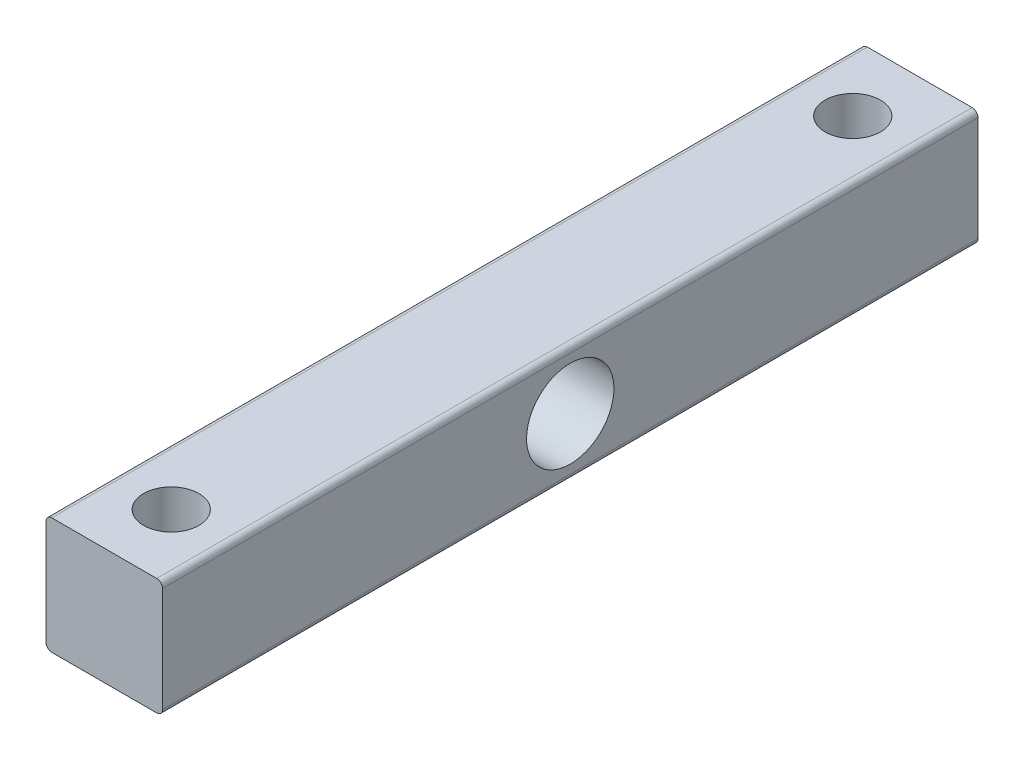
ISO-10303-21;
HEADER;
FILE_DESCRIPTION(('STEP AP214'),'2;1');
FILE_NAME('part.step','',(''),(''),'','','');
FILE_SCHEMA(('AUTOMOTIVE_DESIGN { 1 0 10303 214 1 1 1 1 }'));
ENDSEC;
DATA;
#1=APPLICATION_CONTEXT('core data for automotive mechanical design processes');
#2=APPLICATION_PROTOCOL_DEFINITION('international standard','automotive_design',2000,#1);
#3=PRODUCT_CONTEXT('',#1,'mechanical');
#4=PRODUCT('Part','Part','',(#3));
#5=PRODUCT_RELATED_PRODUCT_CATEGORY('part','',(#4));
#6=PRODUCT_DEFINITION_FORMATION('','',#4);
#7=PRODUCT_DEFINITION_CONTEXT('part definition',#1,'design');
#8=PRODUCT_DEFINITION('design','',#6,#7);
#9=PRODUCT_DEFINITION_SHAPE('','',#8);
#10=(LENGTH_UNIT() NAMED_UNIT(*) SI_UNIT(.MILLI.,.METRE.));
#11=(NAMED_UNIT(*) PLANE_ANGLE_UNIT() SI_UNIT($,.RADIAN.));
#12=(NAMED_UNIT(*) SI_UNIT($,.STERADIAN.) SOLID_ANGLE_UNIT());
#13=UNCERTAINTY_MEASURE_WITH_UNIT(LENGTH_MEASURE(1.E-05),#10,'distance_accuracy_value','');
#14=(GEOMETRIC_REPRESENTATION_CONTEXT(3) GLOBAL_UNCERTAINTY_ASSIGNED_CONTEXT((#13)) GLOBAL_UNIT_ASSIGNED_CONTEXT((#10,
#11,#12)) REPRESENTATION_CONTEXT('',''));
#15=CARTESIAN_POINT('',(0.,0.,0.));
#16=DIRECTION('',(0.,0.,1.));
#17=DIRECTION('',(1.,0.,0.));
#18=AXIS2_PLACEMENT_3D('',#15,#16,#17);
#19=CARTESIAN_POINT('',(-0.0910338190855077,2.68374505848245,17.78));
#20=DIRECTION('',(1.,0.,0.));
#21=DIRECTION('',(0.,1.,0.));
#22=AXIS2_PLACEMENT_3D('',#19,#20,#21);
#23=PLANE('',#22);
#24=CARTESIAN_POINT('',(-0.0910338190855074,0.143745058482447,0.));
#25=DIRECTION('',(-1.,0.,0.));
#26=DIRECTION('',(0.,-1.,0.));
#27=AXIS2_PLACEMENT_3D('',#24,#25,#26);
#28=CIRCLE('',#27,1.905);
#29=CARTESIAN_POINT('',(-0.0910338190855071,-1.76125494151755,0.));
#30=VERTEX_POINT('',#29);
#31=EDGE_CURVE('E204',#30,#30,#28,.T.);
#32=ORIENTED_EDGE('',*,*,#31,.F.);
#33=EDGE_LOOP('',(#32));
#34=FACE_BOUND('',#33,.T.);
#35=DIRECTION('',(0.,-1.,0.));
#36=VECTOR('',#35,1.);
#37=CARTESIAN_POINT('',(-0.0910338190855077,2.68374505848245,-17.78));
#38=LINE('',#37,#36);
#39=CARTESIAN_POINT('',(-0.0910338190855076,2.42974505848245,-17.78));
#40=VERTEX_POINT('',#39);
#41=CARTESIAN_POINT('',(-0.0910338190855071,-2.14225494151755,-17.78));
#42=VERTEX_POINT('',#41);
#43=EDGE_CURVE('E192',#40,#42,#38,.T.);
#44=ORIENTED_EDGE('',*,*,#43,.T.);
#45=DIRECTION('',(0.,0.,-1.));
#46=VECTOR('',#45,1.);
#47=CARTESIAN_POINT('',(-0.0910338190855071,-2.14225494151755,17.78));
#48=LINE('',#47,#46);
#49=CARTESIAN_POINT('',(-0.0910338190855071,-2.14225494151755,17.78));
#50=VERTEX_POINT('',#49);
#51=EDGE_CURVE('E113',#42,#50,#48,.F.);
#52=ORIENTED_EDGE('',*,*,#51,.T.);
#53=DIRECTION('',(0.,-1.,0.));
#54=VECTOR('',#53,1.);
#55=CARTESIAN_POINT('',(-0.0910338190855077,2.68374505848245,17.78));
#56=LINE('',#55,#54);
#57=CARTESIAN_POINT('',(-0.0910338190855076,2.42974505848245,17.78));
#58=VERTEX_POINT('',#57);
#59=EDGE_CURVE('E147',#58,#50,#56,.T.);
#60=ORIENTED_EDGE('',*,*,#59,.F.);
#61=DIRECTION('',(0.,0.,-1.));
#62=VECTOR('',#61,1.);
#63=CARTESIAN_POINT('',(-0.0910338190855076,2.42974505848245,17.78));
#64=LINE('',#63,#62);
#65=EDGE_CURVE('E118',#58,#40,#64,.T.);
#66=ORIENTED_EDGE('',*,*,#65,.T.);
#67=EDGE_LOOP('',(#44,#52,#60,#66));
#68=FACE_BOUND('',#67,.T.);
#69=ADVANCED_FACE('F42',(#34,#68),#23,.F.);
#70=CARTESIAN_POINT('',(-0.091033819085507,-2.39625494151755,17.78));
#71=DIRECTION('',(0.,1.,0.));
#72=DIRECTION('',(0.,0.,1.));
#73=AXIS2_PLACEMENT_3D('',#70,#71,#72);
#74=PLANE('',#73);
#75=CARTESIAN_POINT('',(2.44896618091449,-2.39625494151755,-14.859));
#76=DIRECTION('',(0.,1.,0.));
#77=DIRECTION('',(0.,0.,1.));
#78=AXIS2_PLACEMENT_3D('',#75,#76,#77);
#79=CIRCLE('',#78,1.2065);
#80=CARTESIAN_POINT('',(2.44896618091449,-2.39625494151755,-13.6525));
#81=VERTEX_POINT('',#80);
#82=EDGE_CURVE('E193',#81,#81,#79,.T.);
#83=ORIENTED_EDGE('',*,*,#82,.T.);
#84=EDGE_LOOP('',(#83));
#85=FACE_BOUND('',#84,.T.);
#86=CARTESIAN_POINT('',(2.44896618091449,-2.39625494151755,14.859));
#87=DIRECTION('',(0.,1.,0.));
#88=DIRECTION('',(0.,0.,1.));
#89=AXIS2_PLACEMENT_3D('',#86,#87,#88);
#90=CIRCLE('',#89,1.2065);
#91=CARTESIAN_POINT('',(2.44896618091449,-2.39625494151755,16.0655));
#92=VERTEX_POINT('',#91);
#93=EDGE_CURVE('E138',#92,#92,#90,.F.);
#94=ORIENTED_EDGE('',*,*,#93,.F.);
#95=EDGE_LOOP('',(#94));
#96=FACE_BOUND('',#95,.T.);
#97=DIRECTION('',(1.,0.,0.));
#98=VECTOR('',#97,1.);
#99=CARTESIAN_POINT('',(-0.091033819085507,-2.39625494151755,17.78));
#100=LINE('',#99,#98);
#101=CARTESIAN_POINT('',(0.162966180914493,-2.39625494151755,17.78));
#102=VERTEX_POINT('',#101);
#103=CARTESIAN_POINT('',(4.73496618091449,-2.39625494151755,17.78));
#104=VERTEX_POINT('',#103);
#105=EDGE_CURVE('E128',#102,#104,#100,.T.);
#106=ORIENTED_EDGE('',*,*,#105,.F.);
#107=DIRECTION('',(0.,0.,-1.));
#108=VECTOR('',#107,1.);
#109=CARTESIAN_POINT('',(0.162966180914493,-2.39625494151755,17.78));
#110=LINE('',#109,#108);
#111=CARTESIAN_POINT('',(0.162966180914493,-2.39625494151755,-17.78));
#112=VERTEX_POINT('',#111);
#113=EDGE_CURVE('E112',#102,#112,#110,.T.);
#114=ORIENTED_EDGE('',*,*,#113,.T.);
#115=DIRECTION('',(1.,0.,0.));
#116=VECTOR('',#115,1.);
#117=CARTESIAN_POINT('',(-0.091033819085507,-2.39625494151755,-17.78));
#118=LINE('',#117,#116);
#119=CARTESIAN_POINT('',(4.73496618091449,-2.39625494151755,-17.78));
#120=VERTEX_POINT('',#119);
#121=EDGE_CURVE('E125',#112,#120,#118,.T.);
#122=ORIENTED_EDGE('',*,*,#121,.T.);
#123=DIRECTION('',(0.,0.,-1.));
#124=VECTOR('',#123,1.);
#125=CARTESIAN_POINT('',(4.73496618091449,-2.39625494151755,17.78));
#126=LINE('',#125,#124);
#127=EDGE_CURVE('E130',#120,#104,#126,.F.);
#128=ORIENTED_EDGE('',*,*,#127,.T.);
#129=EDGE_LOOP('',(#106,#114,#122,#128));
#130=FACE_BOUND('',#129,.T.);
#131=ADVANCED_FACE('F124',(#85,#96,#130),#74,.F.);
#132=CARTESIAN_POINT('',(4.98896618091449,2.68374505848245,17.78));
#133=DIRECTION('',(-1.,0.,0.));
#134=DIRECTION('',(0.,-1.,0.));
#135=AXIS2_PLACEMENT_3D('',#132,#133,#134);
#136=PLANE('',#135);
#137=CARTESIAN_POINT('',(4.98896618091449,0.143745058482448,0.));
#138=DIRECTION('',(-1.,0.,0.));
#139=DIRECTION('',(0.,-1.,0.));
#140=AXIS2_PLACEMENT_3D('',#137,#138,#139);
#141=CIRCLE('',#140,1.905);
#142=CARTESIAN_POINT('',(4.98896618091449,-1.76125494151755,0.));
#143=VERTEX_POINT('',#142);
#144=EDGE_CURVE('E201',#143,#143,#141,.F.);
#145=ORIENTED_EDGE('',*,*,#144,.F.);
#146=EDGE_LOOP('',(#145));
#147=FACE_BOUND('',#146,.T.);
#148=DIRECTION('',(0.,1.,0.));
#149=VECTOR('',#148,1.);
#150=CARTESIAN_POINT('',(4.98896618091449,2.68374505848245,17.78));
#151=LINE('',#150,#149);
#152=CARTESIAN_POINT('',(4.98896618091449,-2.14225494151755,17.78));
#153=VERTEX_POINT('',#152);
#154=CARTESIAN_POINT('',(4.98896618091449,2.42974505848245,17.78));
#155=VERTEX_POINT('',#154);
#156=EDGE_CURVE('E151',#153,#155,#151,.T.);
#157=ORIENTED_EDGE('',*,*,#156,.F.);
#158=DIRECTION('',(0.,0.,-1.));
#159=VECTOR('',#158,1.);
#160=CARTESIAN_POINT('',(4.98896618091449,-2.14225494151755,17.78));
#161=LINE('',#160,#159);
#162=CARTESIAN_POINT('',(4.98896618091449,-2.14225494151755,-17.78));
#163=VERTEX_POINT('',#162);
#164=EDGE_CURVE('E172',#153,#163,#161,.T.);
#165=ORIENTED_EDGE('',*,*,#164,.T.);
#166=DIRECTION('',(0.,1.,0.));
#167=VECTOR('',#166,1.);
#168=CARTESIAN_POINT('',(4.98896618091449,2.68374505848245,-17.78));
#169=LINE('',#168,#167);
#170=CARTESIAN_POINT('',(4.98896618091449,2.42974505848245,-17.78));
#171=VERTEX_POINT('',#170);
#172=EDGE_CURVE('E135',#163,#171,#169,.T.);
#173=ORIENTED_EDGE('',*,*,#172,.T.);
#174=DIRECTION('',(0.,0.,-1.));
#175=VECTOR('',#174,1.);
#176=CARTESIAN_POINT('',(4.98896618091449,2.42974505848245,17.78));
#177=LINE('',#176,#175);
#178=EDGE_CURVE('E170',#171,#155,#177,.F.);
#179=ORIENTED_EDGE('',*,*,#178,.T.);
#180=EDGE_LOOP('',(#157,#165,#173,#179));
#181=FACE_BOUND('',#180,.T.);
#182=ADVANCED_FACE('F177',(#147,#181),#136,.F.);
#183=CARTESIAN_POINT('',(-0.0910338190855077,2.68374505848245,17.78));
#184=DIRECTION('',(0.,-1.,0.));
#185=DIRECTION('',(0.,0.,-1.));
#186=AXIS2_PLACEMENT_3D('',#183,#184,#185);
#187=PLANE('',#186);
#188=CARTESIAN_POINT('',(2.44896618091449,2.68374505848245,-14.859));
#189=DIRECTION('',(0.,-1.,0.));
#190=DIRECTION('',(0.,0.,-1.));
#191=AXIS2_PLACEMENT_3D('',#188,#189,#190);
#192=CIRCLE('',#191,1.2065);
#193=CARTESIAN_POINT('',(2.44896618091449,2.68374505848245,-13.6525));
#194=VERTEX_POINT('',#193);
#195=EDGE_CURVE('E196',#194,#194,#192,.T.);
#196=ORIENTED_EDGE('',*,*,#195,.T.);
#197=EDGE_LOOP('',(#196));
#198=FACE_BOUND('',#197,.T.);
#199=CARTESIAN_POINT('',(2.44896618091449,2.68374505848245,14.859));
#200=DIRECTION('',(0.,1.,0.));
#201=DIRECTION('',(0.,0.,1.));
#202=AXIS2_PLACEMENT_3D('',#199,#200,#201);
#203=CIRCLE('',#202,1.2065);
#204=CARTESIAN_POINT('',(2.44896618091449,2.68374505848245,16.0655));
#205=VERTEX_POINT('',#204);
#206=EDGE_CURVE('E134',#205,#205,#203,.T.);
#207=ORIENTED_EDGE('',*,*,#206,.F.);
#208=EDGE_LOOP('',(#207));
#209=FACE_BOUND('',#208,.T.);
#210=DIRECTION('',(-1.,0.,0.));
#211=VECTOR('',#210,1.);
#212=CARTESIAN_POINT('',(-0.0910338190855077,2.68374505848245,17.78));
#213=LINE('',#212,#211);
#214=CARTESIAN_POINT('',(4.73496618091449,2.68374505848245,17.78));
#215=VERTEX_POINT('',#214);
#216=CARTESIAN_POINT('',(0.162966180914492,2.68374505848245,17.78));
#217=VERTEX_POINT('',#216);
#218=EDGE_CURVE('E153',#215,#217,#213,.T.);
#219=ORIENTED_EDGE('',*,*,#218,.F.);
#220=DIRECTION('',(0.,0.,-1.));
#221=VECTOR('',#220,1.);
#222=CARTESIAN_POINT('',(4.73496618091449,2.68374505848245,17.78));
#223=LINE('',#222,#221);
#224=CARTESIAN_POINT('',(4.73496618091449,2.68374505848245,-17.78));
#225=VERTEX_POINT('',#224);
#226=EDGE_CURVE('E12',#215,#225,#223,.T.);
#227=ORIENTED_EDGE('',*,*,#226,.T.);
#228=DIRECTION('',(-1.,0.,0.));
#229=VECTOR('',#228,1.);
#230=CARTESIAN_POINT('',(-0.0910338190855077,2.68374505848245,-17.78));
#231=LINE('',#230,#229);
#232=CARTESIAN_POINT('',(0.162966180914492,2.68374505848245,-17.78));
#233=VERTEX_POINT('',#232);
#234=EDGE_CURVE('E141',#225,#233,#231,.T.);
#235=ORIENTED_EDGE('',*,*,#234,.T.);
#236=DIRECTION('',(0.,0.,-1.));
#237=VECTOR('',#236,1.);
#238=CARTESIAN_POINT('',(0.162966180914492,2.68374505848245,17.78));
#239=LINE('',#238,#237);
#240=EDGE_CURVE('E50',#233,#217,#239,.F.);
#241=ORIENTED_EDGE('',*,*,#240,.T.);
#242=EDGE_LOOP('',(#219,#227,#235,#241));
#243=FACE_BOUND('',#242,.T.);
#244=ADVANCED_FACE('F185',(#198,#209,#243),#187,.F.);
#245=CARTESIAN_POINT('',(0.,0.,17.78));
#246=DIRECTION('',(0.,0.,1.));
#247=DIRECTION('',(1.,0.,0.));
#248=AXIS2_PLACEMENT_3D('',#245,#246,#247);
#249=PLANE('',#248);
#250=ORIENTED_EDGE('',*,*,#59,.T.);
#251=CARTESIAN_POINT('',(0.162966180914493,-2.14225494151755,17.78));
#252=DIRECTION('',(0.,0.,1.));
#253=DIRECTION('',(1.,0.,0.));
#254=AXIS2_PLACEMENT_3D('',#251,#252,#253);
#255=CIRCLE('',#254,0.254);
#256=EDGE_CURVE('E168',#50,#102,#255,.T.);
#257=ORIENTED_EDGE('',*,*,#256,.T.);
#258=ORIENTED_EDGE('',*,*,#105,.T.);
#259=CARTESIAN_POINT('',(4.73496618091449,-2.14225494151755,17.78));
#260=DIRECTION('',(0.,0.,1.));
#261=DIRECTION('',(1.,0.,0.));
#262=AXIS2_PLACEMENT_3D('',#259,#260,#261);
#263=CIRCLE('',#262,0.254);
#264=EDGE_CURVE('E166',#104,#153,#263,.T.);
#265=ORIENTED_EDGE('',*,*,#264,.T.);
#266=ORIENTED_EDGE('',*,*,#156,.T.);
#267=CARTESIAN_POINT('',(4.73496618091449,2.42974505848245,17.78));
#268=DIRECTION('',(0.,0.,1.));
#269=DIRECTION('',(1.,0.,0.));
#270=AXIS2_PLACEMENT_3D('',#267,#268,#269);
#271=CIRCLE('',#270,0.254);
#272=EDGE_CURVE('E63',#155,#215,#271,.T.);
#273=ORIENTED_EDGE('',*,*,#272,.T.);
#274=ORIENTED_EDGE('',*,*,#218,.T.);
#275=CARTESIAN_POINT('',(0.162966180914492,2.42974505848245,17.78));
#276=DIRECTION('',(0.,0.,1.));
#277=DIRECTION('',(1.,0.,0.));
#278=AXIS2_PLACEMENT_3D('',#275,#276,#277);
#279=CIRCLE('',#278,0.254);
#280=EDGE_CURVE('E163',#217,#58,#279,.T.);
#281=ORIENTED_EDGE('',*,*,#280,.T.);
#282=EDGE_LOOP('',(#250,#257,#258,#265,#266,#273,#274,#281));
#283=FACE_BOUND('',#282,.T.);
#284=ADVANCED_FACE('F187',(#283),#249,.T.);
#285=CARTESIAN_POINT('',(2.44896618091449,-5.80875226752383,14.859));
#286=DIRECTION('',(0.,1.,0.));
#287=DIRECTION('',(0.,0.,1.));
#288=AXIS2_PLACEMENT_3D('',#285,#286,#287);
#289=CYLINDRICAL_SURFACE('',#288,1.2065);
#290=CARTESIAN_POINT('',(2.44896618091449,-2.39625494151755,16.0655));
#291=CARTESIAN_POINT('',(2.44896618091449,-2.34333827485088,16.0655));
#292=CARTESIAN_POINT('',(2.44896618091449,-2.29042160818422,16.0655));
#293=CARTESIAN_POINT('',(2.44896618091449,-2.18458827485088,16.0655));
#294=CARTESIAN_POINT('',(2.44896618091449,-2.13167160818422,16.0655));
#295=CARTESIAN_POINT('',(2.44896618091449,-2.02583827485088,16.0655));
#296=CARTESIAN_POINT('',(2.44896618091449,-1.97292160818422,16.0655));
#297=CARTESIAN_POINT('',(2.44896618091449,-1.86708827485088,16.0655));
#298=CARTESIAN_POINT('',(2.44896618091449,-1.81417160818422,16.0655));
#299=CARTESIAN_POINT('',(2.44896618091449,-1.70833827485089,16.0655));
#300=CARTESIAN_POINT('',(2.44896618091449,-1.65542160818422,16.0655));
#301=CARTESIAN_POINT('',(2.44896618091449,-1.54958827485089,16.0655));
#302=CARTESIAN_POINT('',(2.44896618091449,-1.49667160818422,16.0655));
#303=CARTESIAN_POINT('',(2.44896618091449,-1.39083827485088,16.0655));
#304=CARTESIAN_POINT('',(2.44896618091449,-1.33792160818422,16.0655));
#305=CARTESIAN_POINT('',(2.44896618091449,-1.23208827485089,16.0655));
#306=CARTESIAN_POINT('',(2.44896618091449,-1.17917160818422,16.0655));
#307=CARTESIAN_POINT('',(2.44896618091449,-1.07333827485089,16.0655));
#308=CARTESIAN_POINT('',(2.44896618091449,-1.02042160818422,16.0655));
#309=CARTESIAN_POINT('',(2.44896618091449,-0.914588274850885,16.0655));
#310=CARTESIAN_POINT('',(2.44896618091449,-0.861671608184218,16.0655));
#311=CARTESIAN_POINT('',(2.44896618091449,-0.755838274850885,16.0655));
#312=CARTESIAN_POINT('',(2.44896618091449,-0.702921608184218,16.0655));
#313=CARTESIAN_POINT('',(2.44896618091449,-0.597088274850885,16.0655));
#314=CARTESIAN_POINT('',(2.44896618091449,-0.544171608184219,16.0655));
#315=CARTESIAN_POINT('',(2.44896618091449,-0.438338274850885,16.0655));
#316=CARTESIAN_POINT('',(2.44896618091449,-0.385421608184218,16.0655));
#317=CARTESIAN_POINT('',(2.44896618091449,-0.279588274850885,16.0655));
#318=CARTESIAN_POINT('',(2.44896618091449,-0.226671608184219,16.0655));
#319=CARTESIAN_POINT('',(2.44896618091449,-0.120838274850885,16.0655));
#320=CARTESIAN_POINT('',(2.44896618091449,-0.0679216081842183,16.0655));
#321=CARTESIAN_POINT('',(2.44896618091449,0.0379117251491151,16.0655));
#322=CARTESIAN_POINT('',(2.44896618091449,0.0908283918157815,16.0655));
#323=CARTESIAN_POINT('',(2.44896618091449,0.196661725149115,16.0655));
#324=CARTESIAN_POINT('',(2.44896618091449,0.249578391815782,16.0655));
#325=CARTESIAN_POINT('',(2.44896618091449,0.355411725149115,16.0655));
#326=CARTESIAN_POINT('',(2.44896618091449,0.408328391815782,16.0655));
#327=CARTESIAN_POINT('',(2.44896618091449,0.514161725149115,16.0655));
#328=CARTESIAN_POINT('',(2.44896618091449,0.567078391815782,16.0655));
#329=CARTESIAN_POINT('',(2.44896618091449,0.672911725149115,16.0655));
#330=CARTESIAN_POINT('',(2.44896618091449,0.725828391815782,16.0655));
#331=CARTESIAN_POINT('',(2.44896618091449,0.831661725149115,16.0655));
#332=CARTESIAN_POINT('',(2.44896618091449,0.884578391815782,16.0655));
#333=CARTESIAN_POINT('',(2.44896618091449,0.990411725149115,16.0655));
#334=CARTESIAN_POINT('',(2.44896618091449,1.04332839181578,16.0655));
#335=CARTESIAN_POINT('',(2.44896618091449,1.14916172514912,16.0655));
#336=CARTESIAN_POINT('',(2.44896618091449,1.20207839181578,16.0655));
#337=CARTESIAN_POINT('',(2.44896618091449,1.30791172514912,16.0655));
#338=CARTESIAN_POINT('',(2.44896618091449,1.36082839181578,16.0655));
#339=CARTESIAN_POINT('',(2.44896618091449,1.46666172514911,16.0655));
#340=CARTESIAN_POINT('',(2.44896618091449,1.51957839181578,16.0655));
#341=CARTESIAN_POINT('',(2.44896618091449,1.62541172514911,16.0655));
#342=CARTESIAN_POINT('',(2.44896618091449,1.67832839181578,16.0655));
#343=CARTESIAN_POINT('',(2.44896618091449,1.78416172514911,16.0655));
#344=CARTESIAN_POINT('',(2.44896618091449,1.83707839181578,16.0655));
#345=CARTESIAN_POINT('',(2.44896618091449,1.94291172514911,16.0655));
#346=CARTESIAN_POINT('',(2.44896618091449,1.99582839181578,16.0655));
#347=CARTESIAN_POINT('',(2.44896618091449,2.10166172514911,16.0655));
#348=CARTESIAN_POINT('',(2.44896618091449,2.15457839181578,16.0655));
#349=CARTESIAN_POINT('',(2.44896618091449,2.26041172514911,16.0655));
#350=CARTESIAN_POINT('',(2.44896618091449,2.31332839181578,16.0655));
#351=CARTESIAN_POINT('',(2.44896618091449,2.41916172514911,16.0655));
#352=CARTESIAN_POINT('',(2.44896618091449,2.47207839181578,16.0655));
#353=CARTESIAN_POINT('',(2.44896618091449,2.57791172514911,16.0655));
#354=CARTESIAN_POINT('',(2.44896618091449,2.63082839181578,16.0655));
#355=CARTESIAN_POINT('',(2.44896618091449,2.68374505848245,16.0655));
#356=B_SPLINE_CURVE_WITH_KNOTS('',3,(#290,#291,#292,#293,#294,#295,#296,#297,#298,#299,#300,
#301,#302,#303,#304,#305,#306,#307,#308,#309,#310,#311,#312,#313,#314,#315,#316,#317,#318,#319,
#320,#321,#322,#323,#324,#325,#326,#327,#328,#329,#330,#331,#332,#333,#334,#335,#336,#337,#338,
#339,#340,#341,#342,#343,#344,#345,#346,#347,#348,#349,#350,#351,#352,#353,#354,#355),
.UNSPECIFIED.,.F.,.F.,(4,2,2,2,2,2,2,2,2,2,2,2,2,2,2,2,2,2,2,2,2,2,2,2,2,2,2,2,2,2,2,2,4),(0.,
0.15875,0.3175,0.47625,0.635,0.79375,0.9525,1.11125,1.27,1.42875,1.5875,1.74625,1.905,2.06375,
2.2225,2.38125,2.54,2.69875,2.8575,3.01625,3.175,3.33375,3.4925,3.65125,3.81,3.96875,4.1275,
4.28625,4.445,4.60375,4.7625,4.92125,5.08),.UNSPECIFIED.);
#357=EDGE_CURVE('BSEAM242',#92,#205,#356,.T.);
#358=ORIENTED_EDGE('',*,*,#93,.T.);
#359=ORIENTED_EDGE('',*,*,#206,.T.);
#360=ORIENTED_EDGE('',*,*,#357,.T.);
#361=ORIENTED_EDGE('',*,*,#357,.F.);
#362=EDGE_LOOP('',(#358,#360,#359,#361));
#363=FACE_BOUND('',#362,.T.);
#364=ADVANCED_FACE('F242',(#363),#289,.F.);
#365=CARTESIAN_POINT('',(0.,0.,-17.78));
#366=DIRECTION('',(0.,0.,-1.));
#367=DIRECTION('',(1.,0.,0.));
#368=AXIS2_PLACEMENT_3D('',#365,#366,#367);
#369=PLANE('',#368);
#370=ORIENTED_EDGE('',*,*,#121,.F.);
#371=CARTESIAN_POINT('',(0.162966180914493,-2.14225494151755,-17.78));
#372=DIRECTION('',(0.,0.,-1.));
#373=DIRECTION('',(-1.,0.,0.));
#374=AXIS2_PLACEMENT_3D('',#371,#372,#373);
#375=CIRCLE('',#374,0.254);
#376=EDGE_CURVE('E108',#112,#42,#375,.T.);
#377=ORIENTED_EDGE('',*,*,#376,.T.);
#378=ORIENTED_EDGE('',*,*,#43,.F.);
#379=CARTESIAN_POINT('',(0.162966180914492,2.42974505848245,-17.78));
#380=DIRECTION('',(0.,0.,-1.));
#381=DIRECTION('',(-1.,0.,0.));
#382=AXIS2_PLACEMENT_3D('',#379,#380,#381);
#383=CIRCLE('',#382,0.254);
#384=EDGE_CURVE('E129',#40,#233,#383,.T.);
#385=ORIENTED_EDGE('',*,*,#384,.T.);
#386=ORIENTED_EDGE('',*,*,#234,.F.);
#387=CARTESIAN_POINT('',(4.73496618091449,2.42974505848245,-17.78));
#388=DIRECTION('',(0.,0.,-1.));
#389=DIRECTION('',(-1.,0.,0.));
#390=AXIS2_PLACEMENT_3D('',#387,#388,#389);
#391=CIRCLE('',#390,0.254);
#392=EDGE_CURVE('E157',#225,#171,#391,.T.);
#393=ORIENTED_EDGE('',*,*,#392,.T.);
#394=ORIENTED_EDGE('',*,*,#172,.F.);
#395=CARTESIAN_POINT('',(4.73496618091449,-2.14225494151755,-17.78));
#396=DIRECTION('',(0.,0.,-1.));
#397=DIRECTION('',(-1.,0.,0.));
#398=AXIS2_PLACEMENT_3D('',#395,#396,#397);
#399=CIRCLE('',#398,0.254);
#400=EDGE_CURVE('E119',#163,#120,#399,.T.);
#401=ORIENTED_EDGE('',*,*,#400,.T.);
#402=EDGE_LOOP('',(#370,#377,#378,#385,#386,#393,#394,#401));
#403=FACE_BOUND('',#402,.T.);
#404=ADVANCED_FACE('F132',(#403),#369,.T.);
#405=CARTESIAN_POINT('',(2.44896618091449,-5.80875226752383,-14.859));
#406=DIRECTION('',(0.,1.,0.));
#407=DIRECTION('',(0.,0.,1.));
#408=AXIS2_PLACEMENT_3D('',#405,#406,#407);
#409=CYLINDRICAL_SURFACE('',#408,1.2065);
#410=CARTESIAN_POINT('',(2.44896618091449,-2.39625494151755,-13.6525));
#411=CARTESIAN_POINT('',(2.44896618091449,-2.34333827485088,-13.6525));
#412=CARTESIAN_POINT('',(2.44896618091449,-2.29042160818422,-13.6525));
#413=CARTESIAN_POINT('',(2.44896618091449,-2.18458827485088,-13.6525));
#414=CARTESIAN_POINT('',(2.44896618091449,-2.13167160818422,-13.6525));
#415=CARTESIAN_POINT('',(2.44896618091449,-2.02583827485088,-13.6525));
#416=CARTESIAN_POINT('',(2.44896618091449,-1.97292160818422,-13.6525));
#417=CARTESIAN_POINT('',(2.44896618091449,-1.86708827485088,-13.6525));
#418=CARTESIAN_POINT('',(2.44896618091449,-1.81417160818422,-13.6525));
#419=CARTESIAN_POINT('',(2.44896618091449,-1.70833827485089,-13.6525));
#420=CARTESIAN_POINT('',(2.44896618091449,-1.65542160818422,-13.6525));
#421=CARTESIAN_POINT('',(2.44896618091449,-1.54958827485088,-13.6525));
#422=CARTESIAN_POINT('',(2.44896618091449,-1.49667160818422,-13.6525));
#423=CARTESIAN_POINT('',(2.44896618091449,-1.39083827485088,-13.6525));
#424=CARTESIAN_POINT('',(2.44896618091449,-1.33792160818422,-13.6525));
#425=CARTESIAN_POINT('',(2.44896618091449,-1.23208827485088,-13.6525));
#426=CARTESIAN_POINT('',(2.44896618091449,-1.17917160818422,-13.6525));
#427=CARTESIAN_POINT('',(2.44896618091449,-1.07333827485088,-13.6525));
#428=CARTESIAN_POINT('',(2.44896618091449,-1.02042160818422,-13.6525));
#429=CARTESIAN_POINT('',(2.44896618091449,-0.914588274850884,-13.6525));
#430=CARTESIAN_POINT('',(2.44896618091449,-0.861671608184217,-13.6525));
#431=CARTESIAN_POINT('',(2.44896618091449,-0.755838274850884,-13.6525));
#432=CARTESIAN_POINT('',(2.44896618091449,-0.702921608184217,-13.6525));
#433=CARTESIAN_POINT('',(2.44896618091449,-0.597088274850884,-13.6525));
#434=CARTESIAN_POINT('',(2.44896618091449,-0.544171608184217,-13.6525));
#435=CARTESIAN_POINT('',(2.44896618091449,-0.438338274850884,-13.6525));
#436=CARTESIAN_POINT('',(2.44896618091449,-0.385421608184217,-13.6525));
#437=CARTESIAN_POINT('',(2.44896618091449,-0.279588274850884,-13.6525));
#438=CARTESIAN_POINT('',(2.44896618091449,-0.226671608184217,-13.6525));
#439=CARTESIAN_POINT('',(2.44896618091449,-0.120838274850884,-13.6525));
#440=CARTESIAN_POINT('',(2.44896618091449,-0.0679216081842166,-13.6525));
#441=CARTESIAN_POINT('',(2.44896618091449,0.0379117251491168,-13.6525));
#442=CARTESIAN_POINT('',(2.44896618091449,0.0908283918157832,-13.6525));
#443=CARTESIAN_POINT('',(2.44896618091449,0.196661725149117,-13.6525));
#444=CARTESIAN_POINT('',(2.44896618091449,0.249578391815784,-13.6525));
#445=CARTESIAN_POINT('',(2.44896618091449,0.355411725149117,-13.6525));
#446=CARTESIAN_POINT('',(2.44896618091449,0.408328391815783,-13.6525));
#447=CARTESIAN_POINT('',(2.44896618091449,0.514161725149117,-13.6525));
#448=CARTESIAN_POINT('',(2.44896618091449,0.567078391815784,-13.6525));
#449=CARTESIAN_POINT('',(2.44896618091449,0.672911725149117,-13.6525));
#450=CARTESIAN_POINT('',(2.44896618091449,0.725828391815784,-13.6525));
#451=CARTESIAN_POINT('',(2.44896618091449,0.831661725149117,-13.6525));
#452=CARTESIAN_POINT('',(2.44896618091449,0.884578391815784,-13.6525));
#453=CARTESIAN_POINT('',(2.44896618091449,0.990411725149117,-13.6525));
#454=CARTESIAN_POINT('',(2.44896618091449,1.04332839181578,-13.6525));
#455=CARTESIAN_POINT('',(2.44896618091449,1.14916172514912,-13.6525));
#456=CARTESIAN_POINT('',(2.44896618091449,1.20207839181578,-13.6525));
#457=CARTESIAN_POINT('',(2.44896618091449,1.30791172514912,-13.6525));
#458=CARTESIAN_POINT('',(2.44896618091449,1.36082839181578,-13.6525));
#459=CARTESIAN_POINT('',(2.44896618091449,1.46666172514912,-13.6525));
#460=CARTESIAN_POINT('',(2.44896618091449,1.51957839181578,-13.6525));
#461=CARTESIAN_POINT('',(2.44896618091449,1.62541172514912,-13.6525));
#462=CARTESIAN_POINT('',(2.44896618091449,1.67832839181578,-13.6525));
#463=CARTESIAN_POINT('',(2.44896618091449,1.78416172514912,-13.6525));
#464=CARTESIAN_POINT('',(2.44896618091449,1.83707839181578,-13.6525));
#465=CARTESIAN_POINT('',(2.44896618091449,1.94291172514912,-13.6525));
#466=CARTESIAN_POINT('',(2.44896618091449,1.99582839181578,-13.6525));
#467=CARTESIAN_POINT('',(2.44896618091449,2.10166172514912,-13.6525));
#468=CARTESIAN_POINT('',(2.44896618091449,2.15457839181578,-13.6525));
#469=CARTESIAN_POINT('',(2.44896618091449,2.26041172514912,-13.6525));
#470=CARTESIAN_POINT('',(2.44896618091449,2.31332839181578,-13.6525));
#471=CARTESIAN_POINT('',(2.44896618091449,2.41916172514912,-13.6525));
#472=CARTESIAN_POINT('',(2.44896618091449,2.47207839181578,-13.6525));
#473=CARTESIAN_POINT('',(2.44896618091449,2.57791172514912,-13.6525));
#474=CARTESIAN_POINT('',(2.44896618091449,2.63082839181578,-13.6525));
#475=CARTESIAN_POINT('',(2.44896618091449,2.68374505848245,-13.6525));
#476=B_SPLINE_CURVE_WITH_KNOTS('',3,(#410,#411,#412,#413,#414,#415,#416,#417,#418,#419,#420,
#421,#422,#423,#424,#425,#426,#427,#428,#429,#430,#431,#432,#433,#434,#435,#436,#437,#438,#439,
#440,#441,#442,#443,#444,#445,#446,#447,#448,#449,#450,#451,#452,#453,#454,#455,#456,#457,#458,
#459,#460,#461,#462,#463,#464,#465,#466,#467,#468,#469,#470,#471,#472,#473,#474,#475),
.UNSPECIFIED.,.F.,.F.,(4,2,2,2,2,2,2,2,2,2,2,2,2,2,2,2,2,2,2,2,2,2,2,2,2,2,2,2,2,2,2,2,4),(0.,
0.15875,0.3175,0.47625,0.635,0.79375,0.952500000000001,1.11125,1.27,1.42875,1.5875,1.74625,
1.905,2.06375,2.2225,2.38125,2.54,2.69875,2.8575,3.01625,3.175,3.33375,3.4925,3.65125,3.81,
3.96875,4.1275,4.28625,4.445,4.60375,4.7625,4.92125,5.08),.UNSPECIFIED.);
#477=EDGE_CURVE('BSEAM224',#81,#194,#476,.T.);
#478=ORIENTED_EDGE('',*,*,#82,.F.);
#479=ORIENTED_EDGE('',*,*,#195,.F.);
#480=ORIENTED_EDGE('',*,*,#477,.T.);
#481=ORIENTED_EDGE('',*,*,#477,.F.);
#482=EDGE_LOOP('',(#478,#480,#479,#481));
#483=FACE_BOUND('',#482,.T.);
#484=ADVANCED_FACE('F224',(#483),#409,.F.);
#485=CARTESIAN_POINT('',(0.162966180914493,-2.14225494151755,17.78));
#486=DIRECTION('',(0.,0.,-1.));
#487=DIRECTION('',(-1.,0.,0.));
#488=AXIS2_PLACEMENT_3D('',#485,#486,#487);
#489=CYLINDRICAL_SURFACE('',#488,0.254);
#490=ORIENTED_EDGE('',*,*,#256,.F.);
#491=ORIENTED_EDGE('',*,*,#51,.F.);
#492=ORIENTED_EDGE('',*,*,#376,.F.);
#493=ORIENTED_EDGE('',*,*,#113,.F.);
#494=EDGE_LOOP('',(#490,#491,#492,#493));
#495=FACE_BOUND('',#494,.T.);
#496=ADVANCED_FACE('F111',(#495),#489,.T.);
#497=CARTESIAN_POINT('',(4.73496618091449,-2.14225494151755,17.78));
#498=DIRECTION('',(0.,0.,-1.));
#499=DIRECTION('',(-1.,0.,0.));
#500=AXIS2_PLACEMENT_3D('',#497,#498,#499);
#501=CYLINDRICAL_SURFACE('',#500,0.254);
#502=ORIENTED_EDGE('',*,*,#264,.F.);
#503=ORIENTED_EDGE('',*,*,#127,.F.);
#504=ORIENTED_EDGE('',*,*,#400,.F.);
#505=ORIENTED_EDGE('',*,*,#164,.F.);
#506=EDGE_LOOP('',(#502,#503,#504,#505));
#507=FACE_BOUND('',#506,.T.);
#508=ADVANCED_FACE('F223',(#507),#501,.T.);
#509=CARTESIAN_POINT('',(4.73496618091449,2.42974505848245,17.78));
#510=DIRECTION('',(0.,0.,-1.));
#511=DIRECTION('',(-1.,0.,0.));
#512=AXIS2_PLACEMENT_3D('',#509,#510,#511);
#513=CYLINDRICAL_SURFACE('',#512,0.254);
#514=ORIENTED_EDGE('',*,*,#272,.F.);
#515=ORIENTED_EDGE('',*,*,#178,.F.);
#516=ORIENTED_EDGE('',*,*,#392,.F.);
#517=ORIENTED_EDGE('',*,*,#226,.F.);
#518=EDGE_LOOP('',(#514,#515,#516,#517));
#519=FACE_BOUND('',#518,.T.);
#520=ADVANCED_FACE('F184',(#519),#513,.T.);
#521=CARTESIAN_POINT('',(0.162966180914492,2.42974505848245,17.78));
#522=DIRECTION('',(0.,0.,-1.));
#523=DIRECTION('',(-1.,0.,0.));
#524=AXIS2_PLACEMENT_3D('',#521,#522,#523);
#525=CYLINDRICAL_SURFACE('',#524,0.254);
#526=ORIENTED_EDGE('',*,*,#280,.F.);
#527=ORIENTED_EDGE('',*,*,#240,.F.);
#528=ORIENTED_EDGE('',*,*,#384,.F.);
#529=ORIENTED_EDGE('',*,*,#65,.F.);
#530=EDGE_LOOP('',(#526,#527,#528,#529));
#531=FACE_BOUND('',#530,.T.);
#532=ADVANCED_FACE('F44',(#531),#525,.T.);
#533=CARTESIAN_POINT('',(10.377119853556,0.143745058482448,0.));
#534=DIRECTION('',(-1.,0.,0.));
#535=DIRECTION('',(0.,-1.,0.));
#536=AXIS2_PLACEMENT_3D('',#533,#534,#535);
#537=CYLINDRICAL_SURFACE('',#536,1.905);
#538=ORIENTED_EDGE('',*,*,#144,.T.);
#539=EDGE_LOOP('',(#538));
#540=FACE_BOUND('',#539,.T.);
#541=ORIENTED_EDGE('',*,*,#31,.T.);
#542=EDGE_LOOP('',(#541));
#543=FACE_BOUND('',#542,.T.);
#544=ADVANCED_FACE('F208',(#540,#543),#537,.F.);
#545=CLOSED_SHELL('',(#69,#131,#182,#244,#284,#364,#404,#484,#496,#508,#520,#532,#544));
#546=MANIFOLD_SOLID_BREP('B2',#545);
#547=ADVANCED_BREP_SHAPE_REPRESENTATION('',(#18,#546),#14);
#548=SHAPE_DEFINITION_REPRESENTATION(#9,#547);
ENDSEC;
END-ISO-10303-21;
